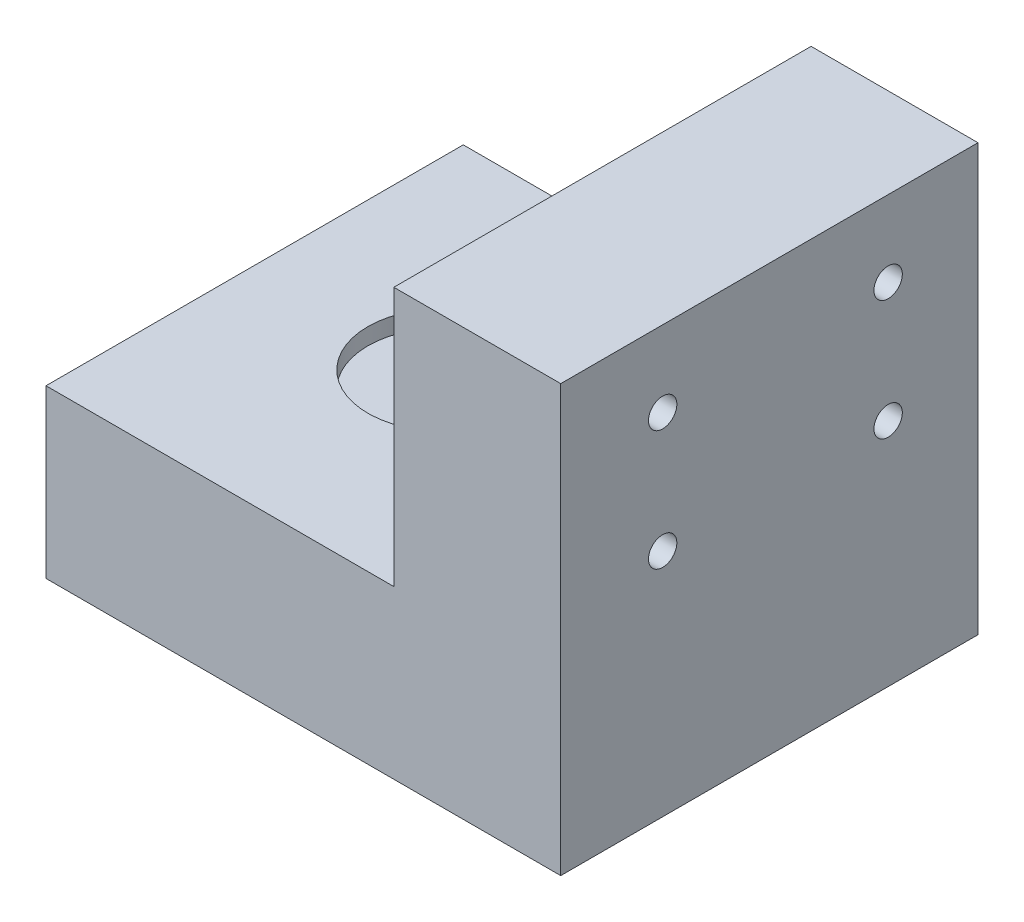
ISO-10303-21;
HEADER;
FILE_DESCRIPTION(('STEP AP214'),'2;1');
FILE_NAME('part.step','',(''),(''),'','','');
FILE_SCHEMA(('AUTOMOTIVE_DESIGN { 1 0 10303 214 1 1 1 1 }'));
ENDSEC;
DATA;
#1=APPLICATION_CONTEXT('core data for automotive mechanical design processes');
#2=APPLICATION_PROTOCOL_DEFINITION('international standard','automotive_design',2000,#1);
#3=PRODUCT_CONTEXT('',#1,'mechanical');
#4=PRODUCT('Part','Part','',(#3));
#5=PRODUCT_RELATED_PRODUCT_CATEGORY('part','',(#4));
#6=PRODUCT_DEFINITION_FORMATION('','',#4);
#7=PRODUCT_DEFINITION_CONTEXT('part definition',#1,'design');
#8=PRODUCT_DEFINITION('design','',#6,#7);
#9=PRODUCT_DEFINITION_SHAPE('','',#8);
#10=(LENGTH_UNIT() NAMED_UNIT(*) SI_UNIT(.MILLI.,.METRE.));
#11=(NAMED_UNIT(*) PLANE_ANGLE_UNIT() SI_UNIT($,.RADIAN.));
#12=(NAMED_UNIT(*) SI_UNIT($,.STERADIAN.) SOLID_ANGLE_UNIT());
#13=UNCERTAINTY_MEASURE_WITH_UNIT(LENGTH_MEASURE(1.E-05),#10,'distance_accuracy_value','');
#14=(GEOMETRIC_REPRESENTATION_CONTEXT(3) GLOBAL_UNCERTAINTY_ASSIGNED_CONTEXT((#13)) GLOBAL_UNIT_ASSIGNED_CONTEXT((#10,
#11,#12)) REPRESENTATION_CONTEXT('',''));
#15=CARTESIAN_POINT('',(0.,0.,0.));
#16=DIRECTION('',(0.,0.,1.));
#17=DIRECTION('',(1.,0.,0.));
#18=AXIS2_PLACEMENT_3D('',#15,#16,#17);
#19=CARTESIAN_POINT('',(-80.7124043362139,-36.3235294117647,24.5731205924058));
#20=DIRECTION('',(0.,1.,0.));
#21=DIRECTION('',(-1.,0.,0.));
#22=AXIS2_PLACEMENT_3D('',#19,#20,#21);
#23=CYLINDRICAL_SURFACE('',#22,3.00000000000001);
#24=CARTESIAN_POINT('',(-80.7124043362139,-36.3235294117647,24.5731205924058));
#25=DIRECTION('',(0.,1.,0.));
#26=DIRECTION('',(-1.,0.,0.));
#27=AXIS2_PLACEMENT_3D('',#24,#25,#26);
#28=CIRCLE('',#27,3.00000000000001);
#29=CARTESIAN_POINT('',(-83.7124043362139,-36.3235294117647,24.5731205924058));
#30=VERTEX_POINT('',#29);
#31=EDGE_CURVE('E292',#30,#30,#28,.T.);
#32=ORIENTED_EDGE('',*,*,#31,.F.);
#33=EDGE_LOOP('',(#32));
#34=FACE_BOUND('',#33,.T.);
#35=CARTESIAN_POINT('',(-80.7124043362139,-18.3235294117647,24.5731205924058));
#36=DIRECTION('',(0.,1.,0.));
#37=DIRECTION('',(-1.,0.,0.));
#38=AXIS2_PLACEMENT_3D('',#35,#36,#37);
#39=CIRCLE('',#38,3.00000000000001);
#40=CARTESIAN_POINT('',(-83.7124043362139,-18.3235294117647,24.5731205924058));
#41=VERTEX_POINT('',#40);
#42=EDGE_CURVE('E44',#41,#41,#39,.F.);
#43=ORIENTED_EDGE('',*,*,#42,.F.);
#44=EDGE_LOOP('',(#43));
#45=FACE_BOUND('',#44,.T.);
#46=ADVANCED_FACE('F41',(#34,#45),#23,.F.);
#47=CARTESIAN_POINT('',(-102.855877094974,-36.3235294117647,50.));
#48=DIRECTION('',(-1.,0.,0.));
#49=DIRECTION('',(0.,-1.,0.));
#50=AXIS2_PLACEMENT_3D('',#47,#48,#49);
#51=PLANE('',#50);
#52=DIRECTION('',(0.,1.,0.));
#53=VECTOR('',#52,1.);
#54=CARTESIAN_POINT('',(-102.855877094974,-36.3235294117647,0.));
#55=LINE('',#54,#53);
#56=CARTESIAN_POINT('',(-102.855877094974,-36.3235294117647,0.));
#57=VERTEX_POINT('',#56);
#58=CARTESIAN_POINT('',(-102.855877094974,-16.3235294117647,0.));
#59=VERTEX_POINT('',#58);
#60=EDGE_CURVE('E133',#57,#59,#55,.T.);
#61=ORIENTED_EDGE('',*,*,#60,.F.);
#62=DIRECTION('',(0.,0.,-1.));
#63=VECTOR('',#62,1.);
#64=CARTESIAN_POINT('',(-102.855877094974,-36.3235294117647,50.));
#65=LINE('',#64,#63);
#66=CARTESIAN_POINT('',(-102.855877094974,-36.3235294117647,50.));
#67=VERTEX_POINT('',#66);
#68=EDGE_CURVE('E11',#67,#57,#65,.T.);
#69=ORIENTED_EDGE('',*,*,#68,.F.);
#70=DIRECTION('',(0.,1.,0.));
#71=VECTOR('',#70,1.);
#72=CARTESIAN_POINT('',(-102.855877094974,-36.3235294117647,50.));
#73=LINE('',#72,#71);
#74=CARTESIAN_POINT('',(-102.855877094974,-16.3235294117647,50.));
#75=VERTEX_POINT('',#74);
#76=EDGE_CURVE('E157',#67,#75,#73,.T.);
#77=ORIENTED_EDGE('',*,*,#76,.T.);
#78=DIRECTION('',(0.,0.,-1.));
#79=VECTOR('',#78,1.);
#80=CARTESIAN_POINT('',(-102.855877094974,-16.3235294117647,50.));
#81=LINE('',#80,#79);
#82=EDGE_CURVE('E95',#75,#59,#81,.T.);
#83=ORIENTED_EDGE('',*,*,#82,.T.);
#84=EDGE_LOOP('',(#61,#69,#77,#83));
#85=FACE_BOUND('',#84,.T.);
#86=ADVANCED_FACE('F43',(#85),#51,.T.);
#87=CARTESIAN_POINT('',(-41.1764705882353,-36.3235294117647,50.));
#88=DIRECTION('',(0.,-1.,0.));
#89=DIRECTION('',(0.,0.,-1.));
#90=AXIS2_PLACEMENT_3D('',#87,#88,#89);
#91=PLANE('',#90);
#92=ORIENTED_EDGE('',*,*,#31,.T.);
#93=EDGE_LOOP('',(#92));
#94=FACE_BOUND('',#93,.T.);
#95=DIRECTION('',(-1.,0.,0.));
#96=VECTOR('',#95,1.);
#97=CARTESIAN_POINT('',(-41.1764705882353,-36.3235294117647,0.));
#98=LINE('',#97,#96);
#99=CARTESIAN_POINT('',(-41.1764705882353,-36.3235294117647,0.));
#100=VERTEX_POINT('',#99);
#101=EDGE_CURVE('E154',#100,#57,#98,.T.);
#102=ORIENTED_EDGE('',*,*,#101,.F.);
#103=DIRECTION('',(0.,0.,-1.));
#104=VECTOR('',#103,1.);
#105=CARTESIAN_POINT('',(-41.1764705882353,-36.3235294117647,50.));
#106=LINE('',#105,#104);
#107=CARTESIAN_POINT('',(-41.1764705882353,-36.3235294117647,50.));
#108=VERTEX_POINT('',#107);
#109=EDGE_CURVE('E55',#108,#100,#106,.T.);
#110=ORIENTED_EDGE('',*,*,#109,.F.);
#111=DIRECTION('',(-1.,0.,0.));
#112=VECTOR('',#111,1.);
#113=CARTESIAN_POINT('',(-41.1764705882353,-36.3235294117647,50.));
#114=LINE('',#113,#112);
#115=EDGE_CURVE('E119',#108,#67,#114,.T.);
#116=ORIENTED_EDGE('',*,*,#115,.T.);
#117=ORIENTED_EDGE('',*,*,#68,.T.);
#118=EDGE_LOOP('',(#102,#110,#116,#117));
#119=FACE_BOUND('',#118,.T.);
#120=ADVANCED_FACE('F167',(#94,#119),#91,.T.);
#121=CARTESIAN_POINT('',(-41.1764705882353,14.7364705882353,50.));
#122=DIRECTION('',(1.,0.,0.));
#123=DIRECTION('',(0.,1.,0.));
#124=AXIS2_PLACEMENT_3D('',#121,#122,#123);
#125=PLANE('',#124);
#126=CARTESIAN_POINT('',(-41.1764705882353,5.63546665777653,10.7681694644787));
#127=DIRECTION('',(-1.,0.,0.));
#128=DIRECTION('',(0.,0.,1.));
#129=AXIS2_PLACEMENT_3D('',#126,#127,#128);
#130=CIRCLE('',#129,1.7);
#131=CARTESIAN_POINT('',(-41.1764705882353,5.63546665777653,12.4681694644787));
#132=VERTEX_POINT('',#131);
#133=EDGE_CURVE('E294',#132,#132,#130,.T.);
#134=ORIENTED_EDGE('',*,*,#133,.T.);
#135=EDGE_LOOP('',(#134));
#136=FACE_BOUND('',#135,.T.);
#137=CARTESIAN_POINT('',(-41.1764705882353,5.63546665777653,37.7869746435902));
#138=DIRECTION('',(-1.,0.,0.));
#139=DIRECTION('',(0.,0.,1.));
#140=AXIS2_PLACEMENT_3D('',#137,#138,#139);
#141=CIRCLE('',#140,1.7);
#142=CARTESIAN_POINT('',(-41.1764705882353,5.63546665777653,39.4869746435902));
#143=VERTEX_POINT('',#142);
#144=EDGE_CURVE('E307',#143,#143,#141,.T.);
#145=ORIENTED_EDGE('',*,*,#144,.T.);
#146=EDGE_LOOP('',(#145));
#147=FACE_BOUND('',#146,.T.);
#148=CARTESIAN_POINT('',(-41.1764705882353,-8.74084946693792,37.7869746435902));
#149=DIRECTION('',(-1.,0.,0.));
#150=DIRECTION('',(0.,0.,1.));
#151=AXIS2_PLACEMENT_3D('',#148,#149,#150);
#152=CIRCLE('',#151,1.7);
#153=CARTESIAN_POINT('',(-41.1764705882353,-8.74084946693792,39.4869746435902));
#154=VERTEX_POINT('',#153);
#155=EDGE_CURVE('E301',#154,#154,#152,.T.);
#156=ORIENTED_EDGE('',*,*,#155,.T.);
#157=EDGE_LOOP('',(#156));
#158=FACE_BOUND('',#157,.T.);
#159=CARTESIAN_POINT('',(-41.1764705882353,-8.74084946693792,10.7681694644787));
#160=DIRECTION('',(-1.,0.,0.));
#161=DIRECTION('',(0.,0.,1.));
#162=AXIS2_PLACEMENT_3D('',#159,#160,#161);
#163=CIRCLE('',#162,1.7);
#164=CARTESIAN_POINT('',(-41.1764705882353,-8.74084946693792,12.4681694644787));
#165=VERTEX_POINT('',#164);
#166=EDGE_CURVE('E138',#165,#165,#163,.T.);
#167=ORIENTED_EDGE('',*,*,#166,.T.);
#168=EDGE_LOOP('',(#167));
#169=FACE_BOUND('',#168,.T.);
#170=DIRECTION('',(0.,-1.,0.));
#171=VECTOR('',#170,1.);
#172=CARTESIAN_POINT('',(-41.1764705882353,14.7364705882353,0.));
#173=LINE('',#172,#171);
#174=CARTESIAN_POINT('',(-41.1764705882353,14.7364705882353,0.));
#175=VERTEX_POINT('',#174);
#176=EDGE_CURVE('E106',#175,#100,#173,.T.);
#177=ORIENTED_EDGE('',*,*,#176,.F.);
#178=DIRECTION('',(0.,0.,-1.));
#179=VECTOR('',#178,1.);
#180=CARTESIAN_POINT('',(-41.1764705882353,14.7364705882353,50.));
#181=LINE('',#180,#179);
#182=CARTESIAN_POINT('',(-41.1764705882353,14.7364705882353,50.));
#183=VERTEX_POINT('',#182);
#184=EDGE_CURVE('E103',#183,#175,#181,.T.);
#185=ORIENTED_EDGE('',*,*,#184,.F.);
#186=DIRECTION('',(0.,-1.,0.));
#187=VECTOR('',#186,1.);
#188=CARTESIAN_POINT('',(-41.1764705882353,14.7364705882353,50.));
#189=LINE('',#188,#187);
#190=EDGE_CURVE('E104',#183,#108,#189,.T.);
#191=ORIENTED_EDGE('',*,*,#190,.T.);
#192=ORIENTED_EDGE('',*,*,#109,.T.);
#193=EDGE_LOOP('',(#177,#185,#191,#192));
#194=FACE_BOUND('',#193,.T.);
#195=ADVANCED_FACE('F101',(#136,#147,#158,#169,#194),#125,.T.);
#196=CARTESIAN_POINT('',(-61.1764705882353,14.7364705882353,50.));
#197=DIRECTION('',(0.,1.,0.));
#198=DIRECTION('',(-1.,0.,0.));
#199=AXIS2_PLACEMENT_3D('',#196,#197,#198);
#200=PLANE('',#199);
#201=DIRECTION('',(1.,0.,0.));
#202=VECTOR('',#201,1.);
#203=CARTESIAN_POINT('',(-61.1764705882353,14.7364705882353,0.));
#204=LINE('',#203,#202);
#205=CARTESIAN_POINT('',(-61.1764705882353,14.7364705882353,0.));
#206=VERTEX_POINT('',#205);
#207=EDGE_CURVE('E149',#206,#175,#204,.T.);
#208=ORIENTED_EDGE('',*,*,#207,.F.);
#209=DIRECTION('',(0.,0.,-1.));
#210=VECTOR('',#209,1.);
#211=CARTESIAN_POINT('',(-61.1764705882353,14.7364705882353,50.));
#212=LINE('',#211,#210);
#213=CARTESIAN_POINT('',(-61.1764705882353,14.7364705882353,50.));
#214=VERTEX_POINT('',#213);
#215=EDGE_CURVE('E115',#214,#206,#212,.T.);
#216=ORIENTED_EDGE('',*,*,#215,.F.);
#217=DIRECTION('',(1.,0.,0.));
#218=VECTOR('',#217,1.);
#219=CARTESIAN_POINT('',(-61.1764705882353,14.7364705882353,50.));
#220=LINE('',#219,#218);
#221=EDGE_CURVE('E117',#214,#183,#220,.T.);
#222=ORIENTED_EDGE('',*,*,#221,.T.);
#223=ORIENTED_EDGE('',*,*,#184,.T.);
#224=EDGE_LOOP('',(#208,#216,#222,#223));
#225=FACE_BOUND('',#224,.T.);
#226=ADVANCED_FACE('F124',(#225),#200,.T.);
#227=CARTESIAN_POINT('',(-61.1764705882353,-16.3235294117647,50.));
#228=DIRECTION('',(-1.,0.,0.));
#229=DIRECTION('',(0.,0.,1.));
#230=AXIS2_PLACEMENT_3D('',#227,#228,#229);
#231=PLANE('',#230);
#232=CARTESIAN_POINT('',(-61.1764705882353,5.63546665777653,10.7681694644787));
#233=DIRECTION('',(-1.,0.,0.));
#234=DIRECTION('',(0.,0.,1.));
#235=AXIS2_PLACEMENT_3D('',#232,#233,#234);
#236=CIRCLE('',#235,1.7);
#237=CARTESIAN_POINT('',(-61.1764705882353,5.63546665777653,12.4681694644787));
#238=VERTEX_POINT('',#237);
#239=EDGE_CURVE('E312',#238,#238,#236,.T.);
#240=ORIENTED_EDGE('',*,*,#239,.F.);
#241=EDGE_LOOP('',(#240));
#242=FACE_BOUND('',#241,.T.);
#243=CARTESIAN_POINT('',(-61.1764705882353,5.63546665777653,37.7869746435902));
#244=DIRECTION('',(-1.,0.,0.));
#245=DIRECTION('',(0.,0.,1.));
#246=AXIS2_PLACEMENT_3D('',#243,#244,#245);
#247=CIRCLE('',#246,1.7);
#248=CARTESIAN_POINT('',(-61.1764705882353,5.63546665777653,39.4869746435902));
#249=VERTEX_POINT('',#248);
#250=EDGE_CURVE('E304',#249,#249,#247,.T.);
#251=ORIENTED_EDGE('',*,*,#250,.F.);
#252=EDGE_LOOP('',(#251));
#253=FACE_BOUND('',#252,.T.);
#254=CARTESIAN_POINT('',(-61.1764705882353,-8.74084946693792,37.7869746435902));
#255=DIRECTION('',(-1.,0.,0.));
#256=DIRECTION('',(0.,0.,1.));
#257=AXIS2_PLACEMENT_3D('',#254,#255,#256);
#258=CIRCLE('',#257,1.7);
#259=CARTESIAN_POINT('',(-61.1764705882353,-8.74084946693792,39.4869746435902));
#260=VERTEX_POINT('',#259);
#261=EDGE_CURVE('E298',#260,#260,#258,.T.);
#262=ORIENTED_EDGE('',*,*,#261,.F.);
#263=EDGE_LOOP('',(#262));
#264=FACE_BOUND('',#263,.T.);
#265=CARTESIAN_POINT('',(-61.1764705882353,-8.74084946693792,10.7681694644787));
#266=DIRECTION('',(-1.,0.,0.));
#267=DIRECTION('',(0.,0.,1.));
#268=AXIS2_PLACEMENT_3D('',#265,#266,#267);
#269=CIRCLE('',#268,1.7);
#270=CARTESIAN_POINT('',(-61.1764705882353,-8.74084946693792,12.4681694644787));
#271=VERTEX_POINT('',#270);
#272=EDGE_CURVE('E297',#271,#271,#269,.T.);
#273=ORIENTED_EDGE('',*,*,#272,.F.);
#274=EDGE_LOOP('',(#273));
#275=FACE_BOUND('',#274,.T.);
#276=DIRECTION('',(0.,1.,0.));
#277=VECTOR('',#276,1.);
#278=CARTESIAN_POINT('',(-61.1764705882353,-16.3235294117647,0.));
#279=LINE('',#278,#277);
#280=CARTESIAN_POINT('',(-61.1764705882353,-16.3235294117647,0.));
#281=VERTEX_POINT('',#280);
#282=EDGE_CURVE('E144',#281,#206,#279,.T.);
#283=ORIENTED_EDGE('',*,*,#282,.F.);
#284=DIRECTION('',(0.,0.,-1.));
#285=VECTOR('',#284,1.);
#286=CARTESIAN_POINT('',(-61.1764705882353,-16.3235294117647,50.));
#287=LINE('',#286,#285);
#288=CARTESIAN_POINT('',(-61.1764705882353,-16.3235294117647,50.));
#289=VERTEX_POINT('',#288);
#290=EDGE_CURVE('E162',#289,#281,#287,.T.);
#291=ORIENTED_EDGE('',*,*,#290,.F.);
#292=DIRECTION('',(0.,1.,0.));
#293=VECTOR('',#292,1.);
#294=CARTESIAN_POINT('',(-61.1764705882353,-16.3235294117647,50.));
#295=LINE('',#294,#293);
#296=EDGE_CURVE('E123',#289,#214,#295,.T.);
#297=ORIENTED_EDGE('',*,*,#296,.T.);
#298=ORIENTED_EDGE('',*,*,#215,.T.);
#299=EDGE_LOOP('',(#283,#291,#297,#298));
#300=FACE_BOUND('',#299,.T.);
#301=ADVANCED_FACE('F230',(#242,#253,#264,#275,#300),#231,.T.);
#302=CARTESIAN_POINT('',(-102.855877094974,-16.3235294117647,50.));
#303=DIRECTION('',(0.,1.,0.));
#304=DIRECTION('',(-1.,0.,0.));
#305=AXIS2_PLACEMENT_3D('',#302,#303,#304);
#306=PLANE('',#305);
#307=CARTESIAN_POINT('',(-80.7124043362139,-16.3235294117647,24.5731205924058));
#308=DIRECTION('',(0.,1.,0.));
#309=DIRECTION('',(-1.,0.,0.));
#310=AXIS2_PLACEMENT_3D('',#307,#308,#309);
#311=CIRCLE('',#310,9.);
#312=CARTESIAN_POINT('',(-89.7124043362139,-16.3235294117647,24.5731205924058));
#313=VERTEX_POINT('',#312);
#314=EDGE_CURVE('E281',#313,#313,#311,.T.);
#315=ORIENTED_EDGE('',*,*,#314,.F.);
#316=EDGE_LOOP('',(#315));
#317=FACE_BOUND('',#316,.T.);
#318=DIRECTION('',(1.,0.,0.));
#319=VECTOR('',#318,1.);
#320=CARTESIAN_POINT('',(-102.855877094974,-16.3235294117647,0.));
#321=LINE('',#320,#319);
#322=EDGE_CURVE('E136',#59,#281,#321,.T.);
#323=ORIENTED_EDGE('',*,*,#322,.F.);
#324=ORIENTED_EDGE('',*,*,#82,.F.);
#325=DIRECTION('',(1.,0.,0.));
#326=VECTOR('',#325,1.);
#327=CARTESIAN_POINT('',(-102.855877094974,-16.3235294117647,50.));
#328=LINE('',#327,#326);
#329=EDGE_CURVE('E126',#75,#289,#328,.T.);
#330=ORIENTED_EDGE('',*,*,#329,.T.);
#331=ORIENTED_EDGE('',*,*,#290,.T.);
#332=EDGE_LOOP('',(#323,#324,#330,#331));
#333=FACE_BOUND('',#332,.T.);
#334=ADVANCED_FACE('F168',(#317,#333),#306,.T.);
#335=CARTESIAN_POINT('',(0.,0.,50.));
#336=DIRECTION('',(0.,0.,-1.));
#337=DIRECTION('',(-1.,0.,0.));
#338=AXIS2_PLACEMENT_3D('',#335,#336,#337);
#339=PLANE('',#338);
#340=ORIENTED_EDGE('',*,*,#76,.F.);
#341=ORIENTED_EDGE('',*,*,#115,.F.);
#342=ORIENTED_EDGE('',*,*,#190,.F.);
#343=ORIENTED_EDGE('',*,*,#221,.F.);
#344=ORIENTED_EDGE('',*,*,#296,.F.);
#345=ORIENTED_EDGE('',*,*,#329,.F.);
#346=EDGE_LOOP('',(#340,#341,#342,#343,#344,#345));
#347=FACE_BOUND('',#346,.T.);
#348=ADVANCED_FACE('F116',(#347),#339,.F.);
#349=CARTESIAN_POINT('',(0.,0.,0.));
#350=DIRECTION('',(0.,0.,-1.));
#351=DIRECTION('',(-1.,0.,0.));
#352=AXIS2_PLACEMENT_3D('',#349,#350,#351);
#353=PLANE('',#352);
#354=ORIENTED_EDGE('',*,*,#60,.T.);
#355=ORIENTED_EDGE('',*,*,#322,.T.);
#356=ORIENTED_EDGE('',*,*,#282,.T.);
#357=ORIENTED_EDGE('',*,*,#207,.T.);
#358=ORIENTED_EDGE('',*,*,#176,.T.);
#359=ORIENTED_EDGE('',*,*,#101,.T.);
#360=EDGE_LOOP('',(#354,#355,#356,#357,#358,#359));
#361=FACE_BOUND('',#360,.T.);
#362=ADVANCED_FACE('F169',(#361),#353,.T.);
#363=CARTESIAN_POINT('',(-41.1764705882353,-8.74084946693792,10.7681694644787));
#364=DIRECTION('',(-1.,0.,0.));
#365=DIRECTION('',(0.,0.,1.));
#366=AXIS2_PLACEMENT_3D('',#363,#364,#365);
#367=CYLINDRICAL_SURFACE('',#366,1.7);
#368=ORIENTED_EDGE('',*,*,#166,.F.);
#369=EDGE_LOOP('',(#368));
#370=FACE_BOUND('',#369,.T.);
#371=ORIENTED_EDGE('',*,*,#272,.T.);
#372=EDGE_LOOP('',(#371));
#373=FACE_BOUND('',#372,.T.);
#374=ADVANCED_FACE('F196',(#370,#373),#367,.F.);
#375=CARTESIAN_POINT('',(-41.1764705882353,-8.74084946693792,37.7869746435902));
#376=DIRECTION('',(-1.,0.,0.));
#377=DIRECTION('',(0.,0.,1.));
#378=AXIS2_PLACEMENT_3D('',#375,#376,#377);
#379=CYLINDRICAL_SURFACE('',#378,1.7);
#380=ORIENTED_EDGE('',*,*,#155,.F.);
#381=EDGE_LOOP('',(#380));
#382=FACE_BOUND('',#381,.T.);
#383=ORIENTED_EDGE('',*,*,#261,.T.);
#384=EDGE_LOOP('',(#383));
#385=FACE_BOUND('',#384,.T.);
#386=ADVANCED_FACE('F193',(#382,#385),#379,.F.);
#387=CARTESIAN_POINT('',(-41.1764705882353,5.63546665777653,37.7869746435902));
#388=DIRECTION('',(-1.,0.,0.));
#389=DIRECTION('',(0.,0.,1.));
#390=AXIS2_PLACEMENT_3D('',#387,#388,#389);
#391=CYLINDRICAL_SURFACE('',#390,1.7);
#392=ORIENTED_EDGE('',*,*,#144,.F.);
#393=EDGE_LOOP('',(#392));
#394=FACE_BOUND('',#393,.T.);
#395=ORIENTED_EDGE('',*,*,#250,.T.);
#396=EDGE_LOOP('',(#395));
#397=FACE_BOUND('',#396,.T.);
#398=ADVANCED_FACE('F199',(#394,#397),#391,.F.);
#399=CARTESIAN_POINT('',(-41.1764705882353,5.63546665777653,10.7681694644787));
#400=DIRECTION('',(-1.,0.,0.));
#401=DIRECTION('',(0.,0.,1.));
#402=AXIS2_PLACEMENT_3D('',#399,#400,#401);
#403=CYLINDRICAL_SURFACE('',#402,1.7);
#404=ORIENTED_EDGE('',*,*,#133,.F.);
#405=EDGE_LOOP('',(#404));
#406=FACE_BOUND('',#405,.T.);
#407=ORIENTED_EDGE('',*,*,#239,.T.);
#408=EDGE_LOOP('',(#407));
#409=FACE_BOUND('',#408,.T.);
#410=ADVANCED_FACE('F205',(#406,#409),#403,.F.);
#411=CARTESIAN_POINT('',(-80.7124043362139,-18.3235294117647,24.5731205924058));
#412=DIRECTION('',(0.,1.,0.));
#413=DIRECTION('',(-1.,0.,0.));
#414=AXIS2_PLACEMENT_3D('',#411,#412,#413);
#415=PLANE('',#414);
#416=CARTESIAN_POINT('',(-80.7124043362139,-18.3235294117647,24.5731205924058));
#417=DIRECTION('',(0.,1.,0.));
#418=DIRECTION('',(-1.,0.,0.));
#419=AXIS2_PLACEMENT_3D('',#416,#417,#418);
#420=CIRCLE('',#419,9.);
#421=CARTESIAN_POINT('',(-89.7124043362139,-18.3235294117647,24.5731205924058));
#422=VERTEX_POINT('',#421);
#423=EDGE_CURVE('E282',#422,#422,#420,.T.);
#424=ORIENTED_EDGE('',*,*,#423,.T.);
#425=EDGE_LOOP('',(#424));
#426=FACE_BOUND('',#425,.T.);
#427=ORIENTED_EDGE('',*,*,#42,.T.);
#428=EDGE_LOOP('',(#427));
#429=FACE_BOUND('',#428,.T.);
#430=ADVANCED_FACE('F207',(#426,#429),#415,.T.);
#431=CARTESIAN_POINT('',(-80.7124043362139,-18.3235294117647,24.5731205924058));
#432=DIRECTION('',(0.,1.,0.));
#433=DIRECTION('',(-1.,0.,0.));
#434=AXIS2_PLACEMENT_3D('',#431,#432,#433);
#435=CYLINDRICAL_SURFACE('',#434,9.);
#436=ORIENTED_EDGE('',*,*,#423,.F.);
#437=EDGE_LOOP('',(#436));
#438=FACE_BOUND('',#437,.T.);
#439=ORIENTED_EDGE('',*,*,#314,.T.);
#440=EDGE_LOOP('',(#439));
#441=FACE_BOUND('',#440,.T.);
#442=ADVANCED_FACE('F194',(#438,#441),#435,.F.);
#443=CLOSED_SHELL('',(#46,#86,#120,#195,#226,#301,#334,#348,#362,#374,#386,#398,#410,#430,#442));
#444=MANIFOLD_SOLID_BREP('B2',#443);
#445=ADVANCED_BREP_SHAPE_REPRESENTATION('',(#18,#444),#14);
#446=SHAPE_DEFINITION_REPRESENTATION(#9,#445);
ENDSEC;
END-ISO-10303-21;
